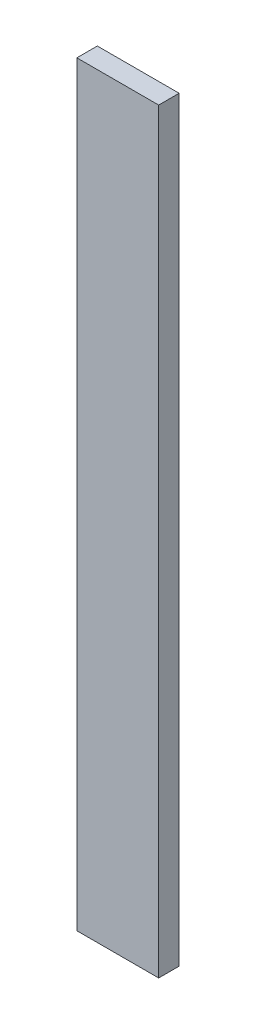
ISO-10303-21;
HEADER;
FILE_DESCRIPTION(('STEP AP214'),'2;1');
FILE_NAME('part.step','',(''),(''),'','','');
FILE_SCHEMA(('AUTOMOTIVE_DESIGN { 1 0 10303 214 1 1 1 1 }'));
ENDSEC;
DATA;
#1=APPLICATION_CONTEXT('core data for automotive mechanical design processes');
#2=APPLICATION_PROTOCOL_DEFINITION('international standard','automotive_design',2000,#1);
#3=PRODUCT_CONTEXT('',#1,'mechanical');
#4=PRODUCT('Part','Part','',(#3));
#5=PRODUCT_RELATED_PRODUCT_CATEGORY('part','',(#4));
#6=PRODUCT_DEFINITION_FORMATION('','',#4);
#7=PRODUCT_DEFINITION_CONTEXT('part definition',#1,'design');
#8=PRODUCT_DEFINITION('design','',#6,#7);
#9=PRODUCT_DEFINITION_SHAPE('','',#8);
#10=(LENGTH_UNIT() NAMED_UNIT(*) SI_UNIT(.MILLI.,.METRE.));
#11=(NAMED_UNIT(*) PLANE_ANGLE_UNIT() SI_UNIT($,.RADIAN.));
#12=(NAMED_UNIT(*) SI_UNIT($,.STERADIAN.) SOLID_ANGLE_UNIT());
#13=UNCERTAINTY_MEASURE_WITH_UNIT(LENGTH_MEASURE(1.E-05),#10,'distance_accuracy_value','');
#14=(GEOMETRIC_REPRESENTATION_CONTEXT(3) GLOBAL_UNCERTAINTY_ASSIGNED_CONTEXT((#13)) GLOBAL_UNIT_ASSIGNED_CONTEXT((#10,
#11,#12)) REPRESENTATION_CONTEXT('',''));
#15=CARTESIAN_POINT('',(0.,0.,0.));
#16=DIRECTION('',(0.,0.,1.));
#17=DIRECTION('',(1.,0.,0.));
#18=AXIS2_PLACEMENT_3D('',#15,#16,#17);
#19=CARTESIAN_POINT('',(12.7,117.348,6.35));
#20=DIRECTION('',(-1.,0.,0.));
#21=DIRECTION('',(0.,-1.,0.));
#22=AXIS2_PLACEMENT_3D('',#19,#20,#21);
#23=PLANE('',#22);
#24=DIRECTION('',(0.,1.,0.));
#25=VECTOR('',#24,1.);
#26=CARTESIAN_POINT('',(12.7,117.348,0.));
#27=LINE('',#26,#25);
#28=CARTESIAN_POINT('',(12.7,-117.348,0.));
#29=VERTEX_POINT('',#28);
#30=CARTESIAN_POINT('',(12.7,117.348,0.));
#31=VERTEX_POINT('',#30);
#32=EDGE_CURVE('E96',#29,#31,#27,.T.);
#33=ORIENTED_EDGE('',*,*,#32,.T.);
#34=DIRECTION('',(0.,0.,-1.));
#35=VECTOR('',#34,1.);
#36=CARTESIAN_POINT('',(12.7,117.348,6.35));
#37=LINE('',#36,#35);
#38=CARTESIAN_POINT('',(12.7,117.348,6.35));
#39=VERTEX_POINT('',#38);
#40=EDGE_CURVE('E11',#39,#31,#37,.T.);
#41=ORIENTED_EDGE('',*,*,#40,.F.);
#42=DIRECTION('',(0.,1.,0.));
#43=VECTOR('',#42,1.);
#44=CARTESIAN_POINT('',(12.7,117.348,6.35));
#45=LINE('',#44,#43);
#46=CARTESIAN_POINT('',(12.7,-117.348,6.35));
#47=VERTEX_POINT('',#46);
#48=EDGE_CURVE('E84',#47,#39,#45,.T.);
#49=ORIENTED_EDGE('',*,*,#48,.F.);
#50=DIRECTION('',(0.,0.,-1.));
#51=VECTOR('',#50,1.);
#52=CARTESIAN_POINT('',(12.7,-117.348,6.35));
#53=LINE('',#52,#51);
#54=EDGE_CURVE('E92',#47,#29,#53,.T.);
#55=ORIENTED_EDGE('',*,*,#54,.T.);
#56=EDGE_LOOP('',(#33,#41,#49,#55));
#57=FACE_BOUND('',#56,.T.);
#58=ADVANCED_FACE('F33',(#57),#23,.F.);
#59=CARTESIAN_POINT('',(-12.7,117.348,6.35));
#60=DIRECTION('',(0.,-1.,0.));
#61=DIRECTION('',(0.,0.,-1.));
#62=AXIS2_PLACEMENT_3D('',#59,#60,#61);
#63=PLANE('',#62);
#64=DIRECTION('',(-1.,0.,0.));
#65=VECTOR('',#64,1.);
#66=CARTESIAN_POINT('',(-12.7,117.348,0.));
#67=LINE('',#66,#65);
#68=CARTESIAN_POINT('',(-12.7,117.348,0.));
#69=VERTEX_POINT('',#68);
#70=EDGE_CURVE('E88',#31,#69,#67,.T.);
#71=ORIENTED_EDGE('',*,*,#70,.T.);
#72=DIRECTION('',(0.,0.,-1.));
#73=VECTOR('',#72,1.);
#74=CARTESIAN_POINT('',(-12.7,117.348,6.35));
#75=LINE('',#74,#73);
#76=CARTESIAN_POINT('',(-12.7,117.348,6.35));
#77=VERTEX_POINT('',#76);
#78=EDGE_CURVE('E41',#77,#69,#75,.T.);
#79=ORIENTED_EDGE('',*,*,#78,.F.);
#80=DIRECTION('',(-1.,0.,0.));
#81=VECTOR('',#80,1.);
#82=CARTESIAN_POINT('',(-12.7,117.348,6.35));
#83=LINE('',#82,#81);
#84=EDGE_CURVE('E79',#39,#77,#83,.T.);
#85=ORIENTED_EDGE('',*,*,#84,.F.);
#86=ORIENTED_EDGE('',*,*,#40,.T.);
#87=EDGE_LOOP('',(#71,#79,#85,#86));
#88=FACE_BOUND('',#87,.T.);
#89=ADVANCED_FACE('F87',(#88),#63,.F.);
#90=CARTESIAN_POINT('',(-12.7,117.348,6.35));
#91=DIRECTION('',(1.,0.,0.));
#92=DIRECTION('',(0.,1.,0.));
#93=AXIS2_PLACEMENT_3D('',#90,#91,#92);
#94=PLANE('',#93);
#95=DIRECTION('',(0.,-1.,0.));
#96=VECTOR('',#95,1.);
#97=CARTESIAN_POINT('',(-12.7,117.348,0.));
#98=LINE('',#97,#96);
#99=CARTESIAN_POINT('',(-12.7,-117.348,0.));
#100=VERTEX_POINT('',#99);
#101=EDGE_CURVE('E66',#69,#100,#98,.T.);
#102=ORIENTED_EDGE('',*,*,#101,.T.);
#103=DIRECTION('',(0.,0.,-1.));
#104=VECTOR('',#103,1.);
#105=CARTESIAN_POINT('',(-12.7,-117.348,6.35));
#106=LINE('',#105,#104);
#107=CARTESIAN_POINT('',(-12.7,-117.348,6.35));
#108=VERTEX_POINT('',#107);
#109=EDGE_CURVE('E89',#108,#100,#106,.T.);
#110=ORIENTED_EDGE('',*,*,#109,.F.);
#111=DIRECTION('',(0.,-1.,0.));
#112=VECTOR('',#111,1.);
#113=CARTESIAN_POINT('',(-12.7,117.348,6.35));
#114=LINE('',#113,#112);
#115=EDGE_CURVE('E82',#77,#108,#114,.T.);
#116=ORIENTED_EDGE('',*,*,#115,.F.);
#117=ORIENTED_EDGE('',*,*,#78,.T.);
#118=EDGE_LOOP('',(#102,#110,#116,#117));
#119=FACE_BOUND('',#118,.T.);
#120=ADVANCED_FACE('F90',(#119),#94,.F.);
#121=CARTESIAN_POINT('',(-12.7,-117.348,6.35));
#122=DIRECTION('',(0.,1.,0.));
#123=DIRECTION('',(0.,0.,1.));
#124=AXIS2_PLACEMENT_3D('',#121,#122,#123);
#125=PLANE('',#124);
#126=DIRECTION('',(1.,0.,0.));
#127=VECTOR('',#126,1.);
#128=CARTESIAN_POINT('',(-12.7,-117.348,0.));
#129=LINE('',#128,#127);
#130=EDGE_CURVE('E72',#100,#29,#129,.T.);
#131=ORIENTED_EDGE('',*,*,#130,.T.);
#132=ORIENTED_EDGE('',*,*,#54,.F.);
#133=DIRECTION('',(1.,0.,0.));
#134=VECTOR('',#133,1.);
#135=CARTESIAN_POINT('',(-12.7,-117.348,6.35));
#136=LINE('',#135,#134);
#137=EDGE_CURVE('E49',#108,#47,#136,.T.);
#138=ORIENTED_EDGE('',*,*,#137,.F.);
#139=ORIENTED_EDGE('',*,*,#109,.T.);
#140=EDGE_LOOP('',(#131,#132,#138,#139));
#141=FACE_BOUND('',#140,.T.);
#142=ADVANCED_FACE('F103',(#141),#125,.F.);
#143=CARTESIAN_POINT('',(0.,0.,6.35));
#144=DIRECTION('',(0.,0.,1.));
#145=DIRECTION('',(1.,0.,0.));
#146=AXIS2_PLACEMENT_3D('',#143,#144,#145);
#147=PLANE('',#146);
#148=ORIENTED_EDGE('',*,*,#48,.T.);
#149=ORIENTED_EDGE('',*,*,#84,.T.);
#150=ORIENTED_EDGE('',*,*,#115,.T.);
#151=ORIENTED_EDGE('',*,*,#137,.T.);
#152=EDGE_LOOP('',(#148,#149,#150,#151));
#153=FACE_BOUND('',#152,.T.);
#154=ADVANCED_FACE('F80',(#153),#147,.T.);
#155=CARTESIAN_POINT('',(0.,0.,0.));
#156=DIRECTION('',(0.,0.,1.));
#157=DIRECTION('',(1.,0.,0.));
#158=AXIS2_PLACEMENT_3D('',#155,#156,#157);
#159=PLANE('',#158);
#160=ORIENTED_EDGE('',*,*,#32,.F.);
#161=ORIENTED_EDGE('',*,*,#130,.F.);
#162=ORIENTED_EDGE('',*,*,#101,.F.);
#163=ORIENTED_EDGE('',*,*,#70,.F.);
#164=EDGE_LOOP('',(#160,#161,#162,#163));
#165=FACE_BOUND('',#164,.T.);
#166=ADVANCED_FACE('F106',(#165),#159,.F.);
#167=CLOSED_SHELL('',(#58,#89,#120,#142,#154,#166));
#168=MANIFOLD_SOLID_BREP('B2',#167);
#169=ADVANCED_BREP_SHAPE_REPRESENTATION('',(#18,#168),#14);
#170=SHAPE_DEFINITION_REPRESENTATION(#9,#169);
ENDSEC;
END-ISO-10303-21;
